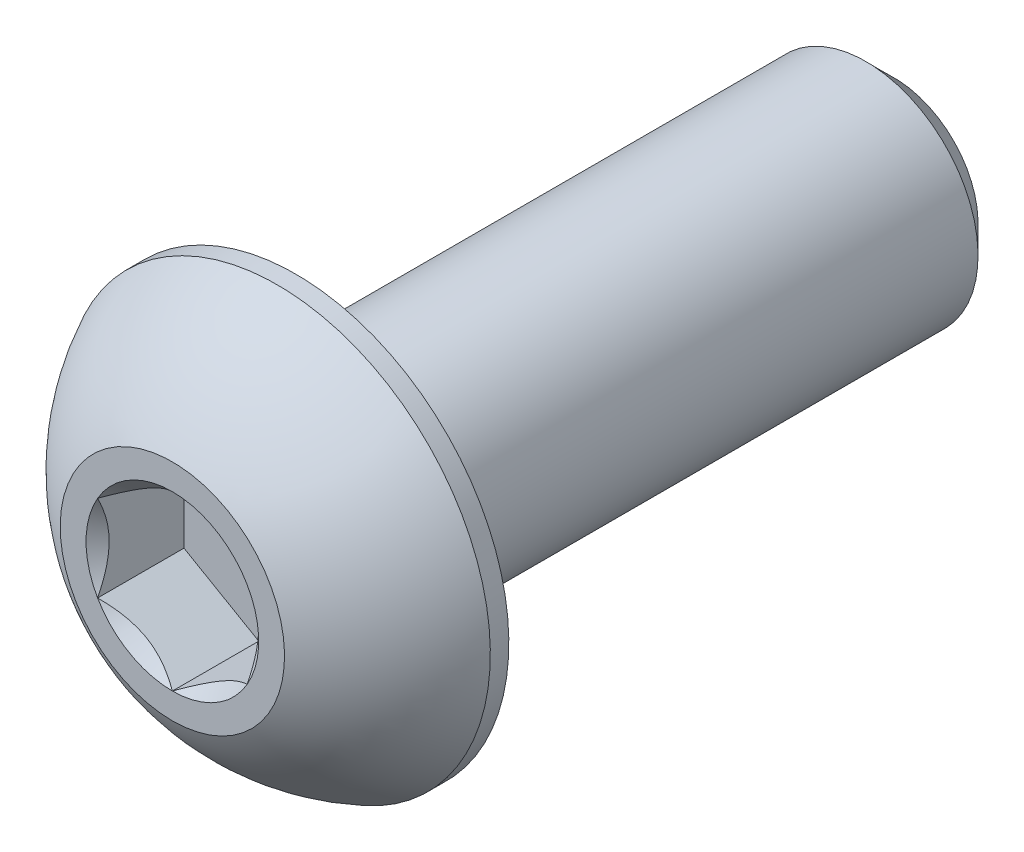
ISO-10303-21;
HEADER;
FILE_DESCRIPTION(('STEP AP214'),'2;1');
FILE_NAME('part.step','',(''),(''),'','','');
FILE_SCHEMA(('AUTOMOTIVE_DESIGN { 1 0 10303 214 1 1 1 1 }'));
ENDSEC;
DATA;
#1=APPLICATION_CONTEXT('core data for automotive mechanical design processes');
#2=APPLICATION_PROTOCOL_DEFINITION('international standard','automotive_design',2000,#1);
#3=PRODUCT_CONTEXT('',#1,'mechanical');
#4=PRODUCT('Part','Part','',(#3));
#5=PRODUCT_RELATED_PRODUCT_CATEGORY('part','',(#4));
#6=PRODUCT_DEFINITION_FORMATION('','',#4);
#7=PRODUCT_DEFINITION_CONTEXT('part definition',#1,'design');
#8=PRODUCT_DEFINITION('design','',#6,#7);
#9=PRODUCT_DEFINITION_SHAPE('','',#8);
#10=(LENGTH_UNIT() NAMED_UNIT(*) SI_UNIT(.MILLI.,.METRE.));
#11=(NAMED_UNIT(*) PLANE_ANGLE_UNIT() SI_UNIT($,.RADIAN.));
#12=(NAMED_UNIT(*) SI_UNIT($,.STERADIAN.) SOLID_ANGLE_UNIT());
#13=UNCERTAINTY_MEASURE_WITH_UNIT(LENGTH_MEASURE(1.E-05),#10,'distance_accuracy_value','');
#14=(GEOMETRIC_REPRESENTATION_CONTEXT(3) GLOBAL_UNCERTAINTY_ASSIGNED_CONTEXT((#13)) GLOBAL_UNIT_ASSIGNED_CONTEXT((#10,
#11,#12)) REPRESENTATION_CONTEXT('',''));
#15=CARTESIAN_POINT('',(0.,0.,0.));
#16=DIRECTION('',(0.,0.,1.));
#17=DIRECTION('',(1.,0.,0.));
#18=AXIS2_PLACEMENT_3D('',#15,#16,#17);
#19=CARTESIAN_POINT('',(0.,0.,-4.));
#20=DIRECTION('',(0.,0.,1.));
#21=DIRECTION('',(0.,-1.,0.));
#22=AXIS2_PLACEMENT_3D('',#19,#20,#21);
#23=PLANE('',#22);
#24=CARTESIAN_POINT('',(0.,0.,-4.));
#25=DIRECTION('',(0.,0.,1.));
#26=DIRECTION('',(0.,-1.,0.));
#27=AXIS2_PLACEMENT_3D('',#24,#25,#26);
#28=CIRCLE('',#27,1.125);
#29=CARTESIAN_POINT('',(0.,-1.125,-4.));
#30=VERTEX_POINT('',#29);
#31=EDGE_CURVE('E55',#30,#30,#28,.T.);
#32=ORIENTED_EDGE('',*,*,#31,.F.);
#33=EDGE_LOOP('',(#32));
#34=FACE_BOUND('',#33,.T.);
#35=ADVANCED_FACE('F41',(#34),#23,.F.);
#36=CARTESIAN_POINT('',(0.,0.,-4.));
#37=DIRECTION('',(0.,0.,1.));
#38=DIRECTION('',(0.,-1.,0.));
#39=AXIS2_PLACEMENT_3D('',#36,#37,#38);
#40=CONICAL_SURFACE('',#39,1.125,0.785398163397446);
#41=CARTESIAN_POINT('',(0.,0.,-3.625));
#42=DIRECTION('',(0.,0.,1.));
#43=DIRECTION('',(0.,-1.,0.));
#44=AXIS2_PLACEMENT_3D('',#41,#42,#43);
#45=CIRCLE('',#44,1.5);
#46=CARTESIAN_POINT('',(0.,-1.5,-3.625));
#47=VERTEX_POINT('',#46);
#48=EDGE_CURVE('E205',#47,#47,#45,.T.);
#49=ORIENTED_EDGE('',*,*,#48,.F.);
#50=EDGE_LOOP('',(#49));
#51=FACE_BOUND('',#50,.T.);
#52=ORIENTED_EDGE('',*,*,#31,.T.);
#53=EDGE_LOOP('',(#52));
#54=FACE_BOUND('',#53,.T.);
#55=ADVANCED_FACE('F212',(#51,#54),#40,.T.);
#56=CARTESIAN_POINT('',(0.,0.,5.65));
#57=DIRECTION('',(0.,0.,1.));
#58=DIRECTION('',(0.,-1.,0.));
#59=AXIS2_PLACEMENT_3D('',#56,#57,#58);
#60=CYLINDRICAL_SURFACE('',#59,1.5);
#61=CARTESIAN_POINT('',(0.,0.,4.));
#62=DIRECTION('',(0.,0.,1.));
#63=DIRECTION('',(0.,-1.,0.));
#64=AXIS2_PLACEMENT_3D('',#61,#62,#63);
#65=CIRCLE('',#64,1.5);
#66=CARTESIAN_POINT('',(0.,-1.5,4.));
#67=VERTEX_POINT('',#66);
#68=EDGE_CURVE('E201',#67,#67,#65,.T.);
#69=ORIENTED_EDGE('',*,*,#68,.F.);
#70=EDGE_LOOP('',(#69));
#71=FACE_BOUND('',#70,.T.);
#72=ORIENTED_EDGE('',*,*,#48,.T.);
#73=EDGE_LOOP('',(#72));
#74=FACE_BOUND('',#73,.T.);
#75=ADVANCED_FACE('F218',(#71,#74),#60,.T.);
#76=CARTESIAN_POINT('',(0.,-2.85,4.));
#77=DIRECTION('',(0.,0.,1.));
#78=DIRECTION('',(0.,-1.,0.));
#79=AXIS2_PLACEMENT_3D('',#76,#77,#78);
#80=PLANE('',#79);
#81=CARTESIAN_POINT('',(0.,0.,4.));
#82=DIRECTION('',(0.,0.,1.));
#83=DIRECTION('',(0.,-1.,0.));
#84=AXIS2_PLACEMENT_3D('',#81,#82,#83);
#85=CIRCLE('',#84,2.85);
#86=CARTESIAN_POINT('',(0.,-2.85,4.));
#87=VERTEX_POINT('',#86);
#88=EDGE_CURVE('E193',#87,#87,#85,.T.);
#89=ORIENTED_EDGE('',*,*,#88,.F.);
#90=EDGE_LOOP('',(#89));
#91=FACE_BOUND('',#90,.T.);
#92=ORIENTED_EDGE('',*,*,#68,.T.);
#93=EDGE_LOOP('',(#92));
#94=FACE_BOUND('',#93,.T.);
#95=ADVANCED_FACE('F223',(#91,#94),#80,.F.);
#96=CARTESIAN_POINT('',(0.,0.,2.85516711229947));
#97=DIRECTION('',(0.,0.,1.));
#98=DIRECTION('',(0.,-1.,0.));
#99=AXIS2_PLACEMENT_3D('',#96,#97,#98);
#100=SPHERICAL_SURFACE('',#99,3.17192226735973);
#101=CARTESIAN_POINT('',(0.,0.,5.65));
#102=DIRECTION('',(0.,0.,1.));
#103=DIRECTION('',(0.,-1.,0.));
#104=AXIS2_PLACEMENT_3D('',#101,#102,#103);
#105=CIRCLE('',#104,1.5);
#106=CARTESIAN_POINT('',(0.,-1.5,5.65));
#107=VERTEX_POINT('',#106);
#108=EDGE_CURVE('E197',#107,#107,#105,.T.);
#109=CARTESIAN_POINT('',(0.,0.,4.2475));
#110=DIRECTION('',(0.,0.,1.));
#111=DIRECTION('',(0.,-1.,0.));
#112=AXIS2_PLACEMENT_3D('',#109,#110,#111);
#113=CIRCLE('',#112,2.85);
#114=CARTESIAN_POINT('',(0.,-2.85,4.2475));
#115=VERTEX_POINT('',#114);
#116=EDGE_CURVE('E189',#115,#115,#113,.T.);
#117=CARTESIAN_POINT('',(0.,-1.5,5.65));
#118=CARTESIAN_POINT('',(0.,-1.5181600798921,5.64025343052664));
#119=CARTESIAN_POINT('',(0.,-1.53622513742981,5.63032981527615));
#120=CARTESIAN_POINT('',(0.,-1.57215840256594,5.61013236887069));
#121=CARTESIAN_POINT('',(0.,-1.59002661016438,5.59985853771571));
#122=CARTESIAN_POINT('',(0.,-1.6255593701915,5.57896453515098));
#123=CARTESIAN_POINT('',(0.,-1.64322392262019,5.56834436374123));
#124=CARTESIAN_POINT('',(0.,-1.67834266450262,5.54676172357303));
#125=CARTESIAN_POINT('',(0.,-1.69579685395635,5.53579925481458));
#126=CARTESIAN_POINT('',(0.,-1.73048823664554,5.51353618336439));
#127=CARTESIAN_POINT('',(0.,-1.74772542988098,5.50223558067265));
#128=CARTESIAN_POINT('',(0.,-1.78197627078176,5.47930053581285));
#129=CARTESIAN_POINT('',(0.,-1.79898991844709,5.46766609364478));
#130=CARTESIAN_POINT('',(0.,-1.83278720341135,5.44406779045309));
#131=CARTESIAN_POINT('',(0.,-1.84957084071028,5.43210392942946));
#132=CARTESIAN_POINT('',(0.,-1.88290172764636,5.40785133450125));
#133=CARTESIAN_POINT('',(0.,-1.8994489772835,5.39556260059666));
#134=CARTESIAN_POINT('',(0.,-1.93230080139369,5.37066492927458));
#135=CARTESIAN_POINT('',(0.,-1.94860537586673,5.35805599185708));
#136=CARTESIAN_POINT('',(0.,-1.98096565436365,5.33252270455889));
#137=CARTESIAN_POINT('',(0.,-1.99702135838753,5.31959835467819));
#138=CARTESIAN_POINT('',(0.,-2.02887779526296,5.29343915334777));
#139=CARTESIAN_POINT('',(0.,-2.04467852811452,5.28020430189805));
#140=CARTESIAN_POINT('',(0.,-2.07601901880464,5.25342912630669));
#141=CARTESIAN_POINT('',(0.,-2.09155877664321,5.23988880216506));
#142=CARTESIAN_POINT('',(0.,-2.12237141262985,5.21250782613789));
#143=CARTESIAN_POINT('',(0.,-2.13764429077792,5.19866717425237));
#144=CARTESIAN_POINT('',(0.,-2.16791736411296,5.17069080180173));
#145=CARTESIAN_POINT('',(0.,-2.18291755929993,5.15655508123663));
#146=CARTESIAN_POINT('',(0.,-2.21263956705414,5.12799394260905));
#147=CARTESIAN_POINT('',(0.,-2.22736137962139,5.11356852454658));
#148=CARTESIAN_POINT('',(0.,-2.2565210282552,5.08443347218353));
#149=CARTESIAN_POINT('',(0.,-2.27095886432177,5.06972383788295));
#150=CARTESIAN_POINT('',(0.,-2.2995450739765,5.04002594229721));
#151=CARTESIAN_POINT('',(0.,-2.31369344756465,5.02503768101205));
#152=CARTESIAN_POINT('',(0.,-2.34169535627252,4.99478822658124));
#153=CARTESIAN_POINT('',(0.,-2.35554889139223,4.97952703343559));
#154=CARTESIAN_POINT('',(0.,-2.38295585920366,4.94873751411442));
#155=CARTESIAN_POINT('',(0.,-2.39650929189537,4.9332091879389));
#156=CARTESIAN_POINT('',(0.,-2.42331090492182,4.90189130289176));
#157=CARTESIAN_POINT('',(0.,-2.43655908525656,4.88610174402014));
#158=CARTESIAN_POINT('',(0.,-2.46274515962755,4.85426739317577));
#159=CARTESIAN_POINT('',(0.,-2.47568305366379,4.83822260120302));
#160=CARTESIAN_POINT('',(0.,-2.5012436393965,4.80588388073287));
#161=CARTESIAN_POINT('',(0.,-2.51386633109298,4.78958995223548));
#162=CARTESIAN_POINT('',(0.,-2.53879171587278,4.7567591499574));
#163=CARTESIAN_POINT('',(0.,-2.55109440895612,4.74022227617671));
#164=CARTESIAN_POINT('',(0.,-2.57537512182785,4.70691186688636));
#165=CARTESIAN_POINT('',(0.,-2.58735314161625,4.6901383313767));
#166=CARTESIAN_POINT('',(0.,-2.61097995657956,4.65636097210575));
#167=CARTESIAN_POINT('',(0.,-2.62262875175448,4.63935714834448));
#168=CARTESIAN_POINT('',(0.,-2.64559269128198,4.60512567355775));
#169=CARTESIAN_POINT('',(0.,-2.65690783563457,4.58789802253229));
#170=CARTESIAN_POINT('',(0.,-2.67920017403639,4.55322543922701));
#171=CARTESIAN_POINT('',(0.,-2.69017736808561,4.53578050694718));
#172=CARTESIAN_POINT('',(0.,-2.71178963499899,4.50067998980005));
#173=CARTESIAN_POINT('',(0.,-2.72242470786316,4.48302440493275));
#174=CARTESIAN_POINT('',(0.,-2.74334869082117,4.44750929096057));
#175=CARTESIAN_POINT('',(0.,-2.75363760091502,4.42964976185571));
#176=CARTESIAN_POINT('',(0.,-2.77386535089241,4.39373354659176));
#177=CARTESIAN_POINT('',(0.,-2.78380419077596,4.37567686043267));
#178=CARTESIAN_POINT('',(0.,-2.80332801615778,4.33937318815589));
#179=CARTESIAN_POINT('',(0.,-2.81291300165605,4.32112620203818));
#180=CARTESIAN_POINT('',(0.,-2.83172550494215,4.2844488779161));
#181=CARTESIAN_POINT('',(0.,-2.84095302272998,4.26601853991173));
#182=CARTESIAN_POINT('',(0.,-2.85,4.2475));
#183=B_SPLINE_CURVE_WITH_KNOTS('',3,(#117,#118,#119,#120,#121,#122,#123,#124,#125,#126,#127,
#128,#129,#130,#131,#132,#133,#134,#135,#136,#137,#138,#139,#140,#141,#142,#143,#144,#145,#146,
#147,#148,#149,#150,#151,#152,#153,#154,#155,#156,#157,#158,#159,#160,#161,#162,#163,#164,#165,
#166,#167,#168,#169,#170,#171,#172,#173,#174,#175,#176,#177,#178,#179,#180,#181,#182),
.UNSPECIFIED.,.F.,.F.,(4,2,2,2,2,2,2,2,2,2,2,2,2,2,2,2,2,2,2,2,2,2,2,2,2,2,2,2,2,2,2,2,4),(0.,
0.0618298941826982,0.123659788365396,0.185489682548094,0.247319576730793,0.309149470913491,
0.370979365096189,0.432809259278888,0.494639153461586,0.556469047644284,0.618298941826983,
0.68012883600968,0.741958730192379,0.803788624375077,0.865618518557775,0.927448412740473,
0.989278306923172,1.05110820110587,1.11293809528857,1.17476798947127,1.23659788365397,
1.29842777783666,1.36025767201936,1.42208756620206,1.48391746038476,1.54574735456746,
1.60757724875015,1.66940714293285,1.73123703711555,1.79306693129825,1.85489682548095,
1.91672671966365,1.97855661384634),.UNSPECIFIED.);
#184=EDGE_CURVE('BSEAM228',#107,#115,#183,.T.);
#185=ORIENTED_EDGE('',*,*,#108,.F.);
#186=ORIENTED_EDGE('',*,*,#116,.T.);
#187=ORIENTED_EDGE('',*,*,#184,.T.);
#188=ORIENTED_EDGE('',*,*,#184,.F.);
#189=EDGE_LOOP('',(#185,#187,#186,#188));
#190=FACE_BOUND('',#189,.T.);
#191=ADVANCED_FACE('F228',(#190),#100,.T.);
#192=CARTESIAN_POINT('',(0.,-1.5,5.65));
#193=DIRECTION('',(0.,0.,-1.));
#194=DIRECTION('',(0.,1.,0.));
#195=AXIS2_PLACEMENT_3D('',#192,#193,#194);
#196=PLANE('',#195);
#197=CARTESIAN_POINT('',(0.,0.,5.65));
#198=DIRECTION('',(0.,0.,1.));
#199=DIRECTION('',(1.,0.,0.));
#200=AXIS2_PLACEMENT_3D('',#197,#198,#199);
#201=CIRCLE('',#200,1.15470053837925);
#202=CARTESIAN_POINT('',(0.,1.15470053837925,5.65));
#203=VERTEX_POINT('',#202);
#204=CARTESIAN_POINT('',(-1.,0.577350269189623,5.65));
#205=VERTEX_POINT('',#204);
#206=EDGE_CURVE('E146',#203,#205,#201,.T.);
#207=ORIENTED_EDGE('',*,*,#206,.F.);
#208=CARTESIAN_POINT('',(1.,0.577350269189625,5.65));
#209=VERTEX_POINT('',#208);
#210=EDGE_CURVE('E141',#209,#203,#201,.T.);
#211=ORIENTED_EDGE('',*,*,#210,.F.);
#212=CARTESIAN_POINT('',(1.,-0.577350269189626,5.65));
#213=VERTEX_POINT('',#212);
#214=EDGE_CURVE('E109',#213,#209,#201,.T.);
#215=ORIENTED_EDGE('',*,*,#214,.F.);
#216=CARTESIAN_POINT('',(0.,-1.15470053837925,5.65));
#217=VERTEX_POINT('',#216);
#218=EDGE_CURVE('E100',#217,#213,#201,.T.);
#219=ORIENTED_EDGE('',*,*,#218,.F.);
#220=CARTESIAN_POINT('',(-1.,-0.577350269189627,5.65));
#221=VERTEX_POINT('',#220);
#222=EDGE_CURVE('E61',#221,#217,#201,.T.);
#223=ORIENTED_EDGE('',*,*,#222,.F.);
#224=EDGE_CURVE('E68',#205,#221,#201,.T.);
#225=ORIENTED_EDGE('',*,*,#224,.F.);
#226=EDGE_LOOP('',(#207,#211,#215,#219,#223,#225));
#227=FACE_BOUND('',#226,.T.);
#228=ORIENTED_EDGE('',*,*,#108,.T.);
#229=EDGE_LOOP('',(#228));
#230=FACE_BOUND('',#229,.T.);
#231=ADVANCED_FACE('F138',(#227,#230),#196,.F.);
#232=CARTESIAN_POINT('',(0.,0.,5.65));
#233=DIRECTION('',(0.,0.,1.));
#234=DIRECTION('',(0.,-1.,0.));
#235=AXIS2_PLACEMENT_3D('',#232,#233,#234);
#236=CYLINDRICAL_SURFACE('',#235,2.85);
#237=ORIENTED_EDGE('',*,*,#116,.F.);
#238=EDGE_LOOP('',(#237));
#239=FACE_BOUND('',#238,.T.);
#240=ORIENTED_EDGE('',*,*,#88,.T.);
#241=EDGE_LOOP('',(#240));
#242=FACE_BOUND('',#241,.T.);
#243=ADVANCED_FACE('F234',(#239,#242),#236,.T.);
#244=CARTESIAN_POINT('',(0.,0.,5.65));
#245=DIRECTION('',(0.,0.,1.));
#246=DIRECTION('',(1.,0.,0.));
#247=AXIS2_PLACEMENT_3D('',#244,#245,#246);
#248=CONICAL_SURFACE('',#247,1.15470053837925,0.78539816339745);
#249=ORIENTED_EDGE('',*,*,#214,.T.);
#250=CARTESIAN_POINT('',(1.,-1.15147208646462,6.02038567751386));
#251=CARTESIAN_POINT('',(1.,-1.12343447988552,5.99921991987371));
#252=CARTESIAN_POINT('',(1.,-1.09524064850697,5.97826169217591));
#253=CARTESIAN_POINT('',(1.,-1.03847715644376,5.93684602223562));
#254=CARTESIAN_POINT('',(1.,-1.00990740382975,5.91638870612366));
#255=CARTESIAN_POINT('',(1.,-0.923120894333478,5.85560479495451));
#256=CARTESIAN_POINT('',(1.,-0.864253173759061,5.8161922289614));
#257=CARTESIAN_POINT('',(1.,-0.740809858258047,5.73882066420021));
#258=CARTESIAN_POINT('',(1.,-0.676100255137808,5.70107303911434));
#259=CARTESIAN_POINT('',(1.,-0.543448939049125,5.63202458755129));
#260=CARTESIAN_POINT('',(1.,-0.47551911202778,5.60070202784687));
#261=CARTESIAN_POINT('',(1.,-0.37355585033353,5.5623817788838));
#262=CARTESIAN_POINT('',(1.,-0.341031989670909,5.55138359164216));
#263=CARTESIAN_POINT('',(1.,-0.275199079052294,5.53199834214736));
#264=CARTESIAN_POINT('',(1.,-0.241889975173934,5.5236114597767));
#265=CARTESIAN_POINT('',(1.,-0.175247517042993,5.51002522071902));
#266=CARTESIAN_POINT('',(1.,-0.141925568218176,5.50477079076797));
#267=CARTESIAN_POINT('',(1.,-0.0749144362322799,5.49754868657089));
#268=CARTESIAN_POINT('',(1.,-0.0412251978501627,5.49558151361051));
#269=CARTESIAN_POINT('',(1.,0.0249580992634199,5.49508319839316));
#270=CARTESIAN_POINT('',(1.,0.0574512826460382,5.49643026788863));
#271=CARTESIAN_POINT('',(1.,0.122148505701866,5.50221648449898));
#272=CARTESIAN_POINT('',(1.,0.154352610132925,5.50665492066154));
#273=CARTESIAN_POINT('',(1.,0.218799898867639,5.5184568301452));
#274=CARTESIAN_POINT('',(1.,0.251033743268952,5.52587054103851));
#275=CARTESIAN_POINT('',(1.,0.314797132354918,5.54322894249868));
#276=CARTESIAN_POINT('',(1.,0.346326735731004,5.55317342128883));
#277=CARTESIAN_POINT('',(1.,0.445594187730204,5.58822348255434));
#278=CARTESIAN_POINT('',(1.,0.511919139476035,5.61732085835672));
#279=CARTESIAN_POINT('',(1.,0.641453244657531,5.6820153296865));
#280=CARTESIAN_POINT('',(1.,0.704650133126343,5.71763577671524));
#281=CARTESIAN_POINT('',(1.,0.825428490174985,5.79112390134693));
#282=CARTESIAN_POINT('',(1.,0.883132947867683,5.82879194713546));
#283=CARTESIAN_POINT('',(1.,0.968148853704563,5.88702285294316));
#284=CARTESIAN_POINT('',(1.,0.996120570380283,5.90663847576286));
#285=CARTESIAN_POINT('',(1.,1.05168177729901,5.94638851706127));
#286=CARTESIAN_POINT('',(1.,1.079271369977,5.96652279219883));
#287=CARTESIAN_POINT('',(1.,1.10670185346329,5.98687211907297));
#288=B_SPLINE_CURVE_WITH_KNOTS('',3,(#250,#251,#252,#253,#254,#255,#256,#257,#258,#259,#260,
#261,#262,#263,#264,#265,#266,#267,#268,#269,#270,#271,#272,#273,#274,#275,#276,#277,#278,#279,
#280,#281,#282,#283,#284,#285,#286,#287),.UNSPECIFIED.,.F.,.F.,(4,2,2,2,2,2,2,2,2,2,2,2,2,2,2,2,
2,2,4),(0.,0.105386459083291,0.210799187330125,0.423233611565469,0.647793540908504,
0.87158087773861,0.974493074181421,1.07741235827201,1.17846428203205,1.27953161415762,
1.3769408673961,1.47432772585408,1.57343322804293,1.67253043972851,1.88917353996827,
2.10660791038813,2.31323734249843,2.41572589232044,2.51818641476503),.UNSPECIFIED.);
#289=EDGE_CURVE('E11',#213,#209,#288,.T.);
#290=ORIENTED_EDGE('',*,*,#289,.F.);
#291=EDGE_LOOP('',(#249,#290));
#292=FACE_BOUND('',#291,.T.);
#293=ADVANCED_FACE('F113',(#292),#248,.F.);
#294=ORIENTED_EDGE('',*,*,#210,.T.);
#295=CARTESIAN_POINT('',(1.0002,0.577234799135786,5.65011548737261));
#296=CARTESIAN_POINT('',(0.965817404992819,0.59708559961862,5.63027793082573));
#297=CARTESIAN_POINT('',(0.930859881860175,0.617268335009454,5.61160502063889));
#298=CARTESIAN_POINT('',(0.85957719704391,0.658423412276684,5.57741474272316));
#299=CARTESIAN_POINT('',(0.823245249471015,0.679399671988078,5.56191640902346));
#300=CARTESIAN_POINT('',(0.749983386196688,0.721697428470845,5.53536730714227));
#301=CARTESIAN_POINT('',(0.713072148554585,0.743008141459635,5.52424977399693));
#302=CARTESIAN_POINT('',(0.63843727068914,0.786098608286185,5.50711986577618));
#303=CARTESIAN_POINT('',(0.600715911891363,0.807877044942279,5.50109469746667));
#304=CARTESIAN_POINT('',(0.535707801582065,0.845409494928861,5.49566055496749));
#305=CARTESIAN_POINT('',(0.508505628471827,0.8611146768966,5.49485693831673));
#306=CARTESIAN_POINT('',(0.454153959330887,0.892494627706028,5.49620669941689));
#307=CARTESIAN_POINT('',(0.427004476245123,0.908169389073952,5.4983607295472));
#308=CARTESIAN_POINT('',(0.345943722673039,0.954969836969509,5.50911697212847));
#309=CARTESIAN_POINT('',(0.292435859021571,0.985862616452446,5.52201455641536));
#310=CARTESIAN_POINT('',(0.198523934856567,1.04008269114923,5.55314073060218));
#311=CARTESIAN_POINT('',(0.157679476328165,1.0636642502755,5.56973779770184));
#312=CARTESIAN_POINT('',(0.0775903626180559,1.10990372163519,5.60712492468529));
#313=CARTESIAN_POINT('',(0.038340989129562,1.1325643579843,5.6279013418174));
#314=CARTESIAN_POINT('',(-0.000200000000000032,1.15481600843309,5.65011548737261));
#315=B_SPLINE_CURVE_WITH_KNOTS('',3,(#295,#296,#297,#298,#299,#300,#301,#302,#303,#304,#305,
#306,#307,#308,#309,#310,#311,#312,#313,#314),.UNSPECIFIED.,.F.,.F.,(4,2,2,2,2,2,2,2,2,4),(0.,
0.13323767682856,0.267252229834491,0.399137076269301,0.53068960328077,0.624814864263848,
0.718960890149134,0.907306626112099,1.05710100361789,1.20641411519286),.UNSPECIFIED.);
#316=EDGE_CURVE('E145',#209,#203,#315,.T.);
#317=ORIENTED_EDGE('',*,*,#316,.F.);
#318=EDGE_LOOP('',(#294,#317));
#319=FACE_BOUND('',#318,.T.);
#320=ADVANCED_FACE('F321',(#319),#248,.F.);
#321=ORIENTED_EDGE('',*,*,#206,.T.);
#322=CARTESIAN_POINT('',(0.000199999999999735,1.15481600843309,5.65011548737261));
#323=CARTESIAN_POINT('',(-0.0341825950071808,1.13496520795025,5.63027793082573));
#324=CARTESIAN_POINT('',(-0.069140118139825,1.11478247255942,5.61160502063889));
#325=CARTESIAN_POINT('',(-0.14042280295609,1.07362739529219,5.57741474272316));
#326=CARTESIAN_POINT('',(-0.176754750528984,1.0526511355808,5.56191640902346));
#327=CARTESIAN_POINT('',(-0.250016613803311,1.01035337909803,5.53536730714227));
#328=CARTESIAN_POINT('',(-0.286927851445415,0.989042666109238,5.52424977399693));
#329=CARTESIAN_POINT('',(-0.361562729310859,0.945952199282689,5.50711986577618));
#330=CARTESIAN_POINT('',(-0.399284088108636,0.924173762626594,5.50109469746667));
#331=CARTESIAN_POINT('',(-0.464292198417934,0.886641312640012,5.49566055496749));
#332=CARTESIAN_POINT('',(-0.491494371528172,0.870936130672273,5.49485693831673));
#333=CARTESIAN_POINT('',(-0.545846040669112,0.839556179862846,5.49620669941689));
#334=CARTESIAN_POINT('',(-0.572995523754876,0.823881418494921,5.4983607295472));
#335=CARTESIAN_POINT('',(-0.65405627732696,0.777080970599364,5.50911697212847));
#336=CARTESIAN_POINT('',(-0.707564140978427,0.746188191116428,5.52201455641536));
#337=CARTESIAN_POINT('',(-0.801476065143431,0.691968116419647,5.55314073060218));
#338=CARTESIAN_POINT('',(-0.842320523671834,0.668386557293369,5.56973779770184));
#339=CARTESIAN_POINT('',(-0.922409637381943,0.622147085933679,5.60712492468529));
#340=CARTESIAN_POINT('',(-0.961659010870437,0.599486449584573,5.6279013418174));
#341=CARTESIAN_POINT('',(-1.0002,0.577234799135786,5.65011548737261));
#342=B_SPLINE_CURVE_WITH_KNOTS('',3,(#322,#323,#324,#325,#326,#327,#328,#329,#330,#331,#332,
#333,#334,#335,#336,#337,#338,#339,#340,#341),.UNSPECIFIED.,.F.,.F.,(4,2,2,2,2,2,2,2,2,4),(0.,
0.133237676828559,0.26725222983449,0.3991370762693,0.530689603280768,0.624814864263846,
0.718960890149133,0.907306626112097,1.05710100361789,1.20641411519286),.UNSPECIFIED.);
#343=EDGE_CURVE('E151',#203,#205,#342,.T.);
#344=ORIENTED_EDGE('',*,*,#343,.F.);
#345=EDGE_LOOP('',(#321,#344));
#346=FACE_BOUND('',#345,.T.);
#347=ADVANCED_FACE('F156',(#346),#248,.F.);
#348=ORIENTED_EDGE('',*,*,#224,.T.);
#349=CARTESIAN_POINT('',(-1.,-1.15147208646462,6.02038567751386));
#350=CARTESIAN_POINT('',(-1.,-1.12343447988552,5.99921991987371));
#351=CARTESIAN_POINT('',(-1.,-1.09524064850697,5.97826169217591));
#352=CARTESIAN_POINT('',(-1.,-1.03847715644376,5.93684602223562));
#353=CARTESIAN_POINT('',(-1.,-1.00990740382975,5.91638870612366));
#354=CARTESIAN_POINT('',(-1.,-0.923120894333479,5.85560479495451));
#355=CARTESIAN_POINT('',(-1.,-0.864253173759061,5.8161922289614));
#356=CARTESIAN_POINT('',(-1.,-0.740809858258047,5.73882066420021));
#357=CARTESIAN_POINT('',(-1.,-0.676100255137809,5.70107303911434));
#358=CARTESIAN_POINT('',(-1.,-0.543448939049126,5.63202458755129));
#359=CARTESIAN_POINT('',(-1.,-0.47551911202778,5.60070202784687));
#360=CARTESIAN_POINT('',(-1.,-0.37355585033353,5.5623817788838));
#361=CARTESIAN_POINT('',(-1.,-0.341031989670909,5.55138359164216));
#362=CARTESIAN_POINT('',(-1.,-0.275199079052295,5.53199834214736));
#363=CARTESIAN_POINT('',(-1.,-0.241889975173934,5.5236114597767));
#364=CARTESIAN_POINT('',(-1.,-0.175247517042994,5.51002522071902));
#365=CARTESIAN_POINT('',(-1.,-0.141925568218176,5.50477079076797));
#366=CARTESIAN_POINT('',(-1.,-0.0749144362322801,5.49754868657089));
#367=CARTESIAN_POINT('',(-1.,-0.0412251978501628,5.49558151361051));
#368=CARTESIAN_POINT('',(-1.,0.02495809926342,5.49508319839316));
#369=CARTESIAN_POINT('',(-1.,0.0574512826460383,5.49643026788863));
#370=CARTESIAN_POINT('',(-1.,0.122148505701866,5.50221648449898));
#371=CARTESIAN_POINT('',(-1.,0.154352610132925,5.50665492066154));
#372=CARTESIAN_POINT('',(-1.,0.218799898867639,5.5184568301452));
#373=CARTESIAN_POINT('',(-1.,0.251033743268953,5.52587054103851));
#374=CARTESIAN_POINT('',(-1.,0.314797132354918,5.54322894249868));
#375=CARTESIAN_POINT('',(-1.,0.346326735731003,5.55317342128883));
#376=CARTESIAN_POINT('',(-1.,0.445594187730203,5.58822348255434));
#377=CARTESIAN_POINT('',(-1.,0.511919139476035,5.61732085835672));
#378=CARTESIAN_POINT('',(-1.,0.64145324465753,5.6820153296865));
#379=CARTESIAN_POINT('',(-1.,0.704650133126342,5.71763577671524));
#380=CARTESIAN_POINT('',(-1.,0.825428490174984,5.79112390134693));
#381=CARTESIAN_POINT('',(-1.,0.883132947867681,5.82879194713546));
#382=CARTESIAN_POINT('',(-1.,0.968148853704562,5.88702285294316));
#383=CARTESIAN_POINT('',(-1.,0.996120570380282,5.90663847576285));
#384=CARTESIAN_POINT('',(-1.,1.05168177729901,5.94638851706127));
#385=CARTESIAN_POINT('',(-1.,1.079271369977,5.96652279219883));
#386=CARTESIAN_POINT('',(-1.,1.10670185346329,5.98687211907297));
#387=B_SPLINE_CURVE_WITH_KNOTS('',3,(#349,#350,#351,#352,#353,#354,#355,#356,#357,#358,#359,
#360,#361,#362,#363,#364,#365,#366,#367,#368,#369,#370,#371,#372,#373,#374,#375,#376,#377,#378,
#379,#380,#381,#382,#383,#384,#385,#386),.UNSPECIFIED.,.F.,.F.,(4,2,2,2,2,2,2,2,2,2,2,2,2,2,2,2,
2,2,4),(0.,0.105386459083291,0.210799187330125,0.42323361156547,0.647793540908505,
0.871580877738611,0.974493074181422,1.07741235827201,1.17846428203205,1.27953161415762,
1.37694086739611,1.47432772585408,1.57343322804293,1.67253043972852,1.88917353996827,
2.10660791038813,2.31323734249843,2.41572589232044,2.51818641476503),.UNSPECIFIED.);
#388=EDGE_CURVE('E159',#205,#221,#387,.F.);
#389=ORIENTED_EDGE('',*,*,#388,.F.);
#390=EDGE_LOOP('',(#348,#389));
#391=FACE_BOUND('',#390,.T.);
#392=ADVANCED_FACE('F160',(#391),#248,.F.);
#393=ORIENTED_EDGE('',*,*,#222,.T.);
#394=CARTESIAN_POINT('',(-1.0002,-0.57723479913579,5.65011548737261));
#395=CARTESIAN_POINT('',(-0.965817404992818,-0.597085599618623,5.63027793082573));
#396=CARTESIAN_POINT('',(-0.930859881860174,-0.617268335009458,5.61160502063889));
#397=CARTESIAN_POINT('',(-0.85957719704391,-0.658423412276688,5.57741474272316));
#398=CARTESIAN_POINT('',(-0.823245249471016,-0.679399671988081,5.56191640902346));
#399=CARTESIAN_POINT('',(-0.749983386196689,-0.721697428470848,5.53536730714227));
#400=CARTESIAN_POINT('',(-0.713072148554585,-0.743008141459638,5.52424977399693));
#401=CARTESIAN_POINT('',(-0.638437270689141,-0.786098608286187,5.50711986577618));
#402=CARTESIAN_POINT('',(-0.600715911891364,-0.807877044942282,5.50109469746667));
#403=CARTESIAN_POINT('',(-0.535707801582067,-0.845409494928864,5.49566055496749));
#404=CARTESIAN_POINT('',(-0.508505628471828,-0.861114676896603,5.49485693831673));
#405=CARTESIAN_POINT('',(-0.454153959330888,-0.89249462770603,5.49620669941689));
#406=CARTESIAN_POINT('',(-0.427004476245124,-0.908169389073955,5.4983607295472));
#407=CARTESIAN_POINT('',(-0.34594372267304,-0.954969836969512,5.50911697212847));
#408=CARTESIAN_POINT('',(-0.292435859021573,-0.985862616452448,5.52201455641536));
#409=CARTESIAN_POINT('',(-0.198523934856568,-1.04008269114923,5.55314073060218));
#410=CARTESIAN_POINT('',(-0.157679476328165,-1.06366425027551,5.56973779770184));
#411=CARTESIAN_POINT('',(-0.0775903626180559,-1.1099037216352,5.60712492468529));
#412=CARTESIAN_POINT('',(-0.0383409891295619,-1.1325643579843,5.6279013418174));
#413=CARTESIAN_POINT('',(0.000200000000000337,-1.15481600843309,5.65011548737262));
#414=B_SPLINE_CURVE_WITH_KNOTS('',3,(#394,#395,#396,#397,#398,#399,#400,#401,#402,#403,#404,
#405,#406,#407,#408,#409,#410,#411,#412,#413),.UNSPECIFIED.,.F.,.F.,(4,2,2,2,2,2,2,2,2,4),(0.,
0.133237676828559,0.26725222983449,0.3991370762693,0.530689603280767,0.624814864263845,
0.718960890149132,0.907306626112096,1.05710100361789,1.20641411519286),.UNSPECIFIED.);
#415=EDGE_CURVE('E126',#221,#217,#414,.T.);
#416=ORIENTED_EDGE('',*,*,#415,.F.);
#417=EDGE_LOOP('',(#393,#416));
#418=FACE_BOUND('',#417,.T.);
#419=ADVANCED_FACE('F262',(#418),#248,.F.);
#420=ORIENTED_EDGE('',*,*,#218,.T.);
#421=CARTESIAN_POINT('',(-0.000199999999999511,-1.15481600843309,5.65011548737262));
#422=CARTESIAN_POINT('',(0.034182595007181,-1.13496520795026,5.63027793082573));
#423=CARTESIAN_POINT('',(0.0691401181398251,-1.11478247255942,5.61160502063889));
#424=CARTESIAN_POINT('',(0.14042280295609,-1.07362739529219,5.57741474272316));
#425=CARTESIAN_POINT('',(0.176754750528984,-1.0526511355808,5.56191640902346));
#426=CARTESIAN_POINT('',(0.250016613803311,-1.01035337909803,5.53536730714227));
#427=CARTESIAN_POINT('',(0.286927851445414,-0.989042666109242,5.52424977399693));
#428=CARTESIAN_POINT('',(0.361562729310859,-0.945952199282693,5.50711986577618));
#429=CARTESIAN_POINT('',(0.399284088108635,-0.924173762626598,5.50109469746667));
#430=CARTESIAN_POINT('',(0.464292198417933,-0.886641312640016,5.4956605549675));
#431=CARTESIAN_POINT('',(0.491494371528172,-0.870936130672277,5.49485693831673));
#432=CARTESIAN_POINT('',(0.545846040669111,-0.83955617986285,5.49620669941689));
#433=CARTESIAN_POINT('',(0.572995523754875,-0.823881418494925,5.4983607295472));
#434=CARTESIAN_POINT('',(0.65405627732696,-0.777080970599368,5.50911697212847));
#435=CARTESIAN_POINT('',(0.707564140978427,-0.746188191116432,5.52201455641536));
#436=CARTESIAN_POINT('',(0.801476065143431,-0.691968116419651,5.55314073060218));
#437=CARTESIAN_POINT('',(0.842320523671834,-0.668386557293373,5.56973779770184));
#438=CARTESIAN_POINT('',(0.922409637381943,-0.622147085933683,5.60712492468529));
#439=CARTESIAN_POINT('',(0.961659010870437,-0.599486449584577,5.6279013418174));
#440=CARTESIAN_POINT('',(1.0002,-0.577234799135789,5.65011548737262));
#441=B_SPLINE_CURVE_WITH_KNOTS('',3,(#421,#422,#423,#424,#425,#426,#427,#428,#429,#430,#431,
#432,#433,#434,#435,#436,#437,#438,#439,#440),.UNSPECIFIED.,.F.,.F.,(4,2,2,2,2,2,2,2,2,4),(0.,
0.133237676828559,0.26725222983449,0.399137076269299,0.530689603280767,0.624814864263845,
0.718960890149132,0.907306626112096,1.05710100361789,1.20641411519286),.UNSPECIFIED.);
#442=EDGE_CURVE('E104',#217,#213,#441,.T.);
#443=ORIENTED_EDGE('',*,*,#442,.F.);
#444=EDGE_LOOP('',(#420,#443));
#445=FACE_BOUND('',#444,.T.);
#446=ADVANCED_FACE('F102',(#445),#248,.F.);
#447=CARTESIAN_POINT('',(1.,-0.577350269189627,4.495));
#448=DIRECTION('',(0.,0.,1.));
#449=DIRECTION('',(1.,0.,0.));
#450=AXIS2_PLACEMENT_3D('',#447,#448,#449);
#451=PLANE('',#450);
#452=DIRECTION('',(0.866025403784438,0.5,0.));
#453=VECTOR('',#452,1.);
#454=CARTESIAN_POINT('',(0.,-1.15470053837925,4.495));
#455=LINE('',#454,#453);
#456=CARTESIAN_POINT('',(0.,-1.15470053837925,4.495));
#457=VERTEX_POINT('',#456);
#458=CARTESIAN_POINT('',(1.,-0.577350269189627,4.495));
#459=VERTEX_POINT('',#458);
#460=EDGE_CURVE('E125',#457,#459,#455,.T.);
#461=ORIENTED_EDGE('',*,*,#460,.T.);
#462=DIRECTION('',(0.,1.,0.));
#463=VECTOR('',#462,1.);
#464=CARTESIAN_POINT('',(1.,-0.577350269189627,4.495));
#465=LINE('',#464,#463);
#466=CARTESIAN_POINT('',(1.,0.577350269189624,4.495));
#467=VERTEX_POINT('',#466);
#468=EDGE_CURVE('E130',#459,#467,#465,.T.);
#469=ORIENTED_EDGE('',*,*,#468,.T.);
#470=DIRECTION('',(-0.866025403784439,0.5,0.));
#471=VECTOR('',#470,1.);
#472=CARTESIAN_POINT('',(1.,0.577350269189624,4.495));
#473=LINE('',#472,#471);
#474=CARTESIAN_POINT('',(0.,1.15470053837925,4.495));
#475=VERTEX_POINT('',#474);
#476=EDGE_CURVE('E296',#467,#475,#473,.T.);
#477=ORIENTED_EDGE('',*,*,#476,.T.);
#478=DIRECTION('',(-0.866025403784438,-0.5,0.));
#479=VECTOR('',#478,1.);
#480=CARTESIAN_POINT('',(0.,1.15470053837925,4.495));
#481=LINE('',#480,#479);
#482=CARTESIAN_POINT('',(-1.,0.577350269189624,4.495));
#483=VERTEX_POINT('',#482);
#484=EDGE_CURVE('E299',#475,#483,#481,.T.);
#485=ORIENTED_EDGE('',*,*,#484,.T.);
#486=DIRECTION('',(0.,-1.,0.));
#487=VECTOR('',#486,1.);
#488=CARTESIAN_POINT('',(-1.,0.577350269189624,4.495));
#489=LINE('',#488,#487);
#490=CARTESIAN_POINT('',(-1.,-0.577350269189627,4.495));
#491=VERTEX_POINT('',#490);
#492=EDGE_CURVE('E176',#483,#491,#489,.T.);
#493=ORIENTED_EDGE('',*,*,#492,.T.);
#494=DIRECTION('',(0.866025403784439,-0.5,0.));
#495=VECTOR('',#494,1.);
#496=CARTESIAN_POINT('',(-1.,-0.577350269189627,4.495));
#497=LINE('',#496,#495);
#498=EDGE_CURVE('E134',#491,#457,#497,.T.);
#499=ORIENTED_EDGE('',*,*,#498,.T.);
#500=EDGE_LOOP('',(#461,#469,#477,#485,#493,#499));
#501=FACE_BOUND('',#500,.T.);
#502=ADVANCED_FACE('F261',(#501),#451,.T.);
#503=CARTESIAN_POINT('',(1.,-0.577350269189627,4.495));
#504=DIRECTION('',(1.,0.,0.));
#505=DIRECTION('',(0.,0.,-1.));
#506=AXIS2_PLACEMENT_3D('',#503,#504,#505);
#507=PLANE('',#506);
#508=DIRECTION('',(0.,0.,1.));
#509=VECTOR('',#508,1.);
#510=CARTESIAN_POINT('',(1.,-0.577350269189627,4.495));
#511=LINE('',#510,#509);
#512=EDGE_CURVE('E121',#459,#213,#511,.T.);
#513=ORIENTED_EDGE('',*,*,#512,.T.);
#514=ORIENTED_EDGE('',*,*,#289,.T.);
#515=DIRECTION('',(0.,0.,1.));
#516=VECTOR('',#515,1.);
#517=CARTESIAN_POINT('',(1.,0.577350269189624,4.495));
#518=LINE('',#517,#516);
#519=EDGE_CURVE('E133',#467,#209,#518,.T.);
#520=ORIENTED_EDGE('',*,*,#519,.F.);
#521=ORIENTED_EDGE('',*,*,#468,.F.);
#522=EDGE_LOOP('',(#513,#514,#520,#521));
#523=FACE_BOUND('',#522,.T.);
#524=ADVANCED_FACE('F128',(#523),#507,.F.);
#525=CARTESIAN_POINT('',(1.,0.577350269189624,4.495));
#526=DIRECTION('',(0.5,0.866025403784439,0.));
#527=DIRECTION('',(-0.866025403784439,0.5,0.));
#528=AXIS2_PLACEMENT_3D('',#525,#526,#527);
#529=PLANE('',#528);
#530=ORIENTED_EDGE('',*,*,#519,.T.);
#531=ORIENTED_EDGE('',*,*,#316,.T.);
#532=DIRECTION('',(0.,0.,1.));
#533=VECTOR('',#532,1.);
#534=CARTESIAN_POINT('',(0.,1.15470053837925,4.495));
#535=LINE('',#534,#533);
#536=EDGE_CURVE('E171',#475,#203,#535,.T.);
#537=ORIENTED_EDGE('',*,*,#536,.F.);
#538=ORIENTED_EDGE('',*,*,#476,.F.);
#539=EDGE_LOOP('',(#530,#531,#537,#538));
#540=FACE_BOUND('',#539,.T.);
#541=ADVANCED_FACE('F287',(#540),#529,.F.);
#542=CARTESIAN_POINT('',(0.,1.15470053837925,4.495));
#543=DIRECTION('',(-0.5,0.866025403784439,0.));
#544=DIRECTION('',(-0.866025403784439,-0.5,0.));
#545=AXIS2_PLACEMENT_3D('',#542,#543,#544);
#546=PLANE('',#545);
#547=ORIENTED_EDGE('',*,*,#536,.T.);
#548=ORIENTED_EDGE('',*,*,#343,.T.);
#549=DIRECTION('',(0.,0.,1.));
#550=VECTOR('',#549,1.);
#551=CARTESIAN_POINT('',(-1.,0.577350269189624,4.495));
#552=LINE('',#551,#550);
#553=EDGE_CURVE('E169',#483,#205,#552,.T.);
#554=ORIENTED_EDGE('',*,*,#553,.F.);
#555=ORIENTED_EDGE('',*,*,#484,.F.);
#556=EDGE_LOOP('',(#547,#548,#554,#555));
#557=FACE_BOUND('',#556,.T.);
#558=ADVANCED_FACE('F167',(#557),#546,.F.);
#559=CARTESIAN_POINT('',(-1.,0.577350269189624,4.495));
#560=DIRECTION('',(-1.,0.,0.));
#561=DIRECTION('',(0.,0.,1.));
#562=AXIS2_PLACEMENT_3D('',#559,#560,#561);
#563=PLANE('',#562);
#564=ORIENTED_EDGE('',*,*,#553,.T.);
#565=ORIENTED_EDGE('',*,*,#388,.T.);
#566=DIRECTION('',(0.,0.,1.));
#567=VECTOR('',#566,1.);
#568=CARTESIAN_POINT('',(-1.,-0.577350269189627,4.495));
#569=LINE('',#568,#567);
#570=EDGE_CURVE('E179',#491,#221,#569,.T.);
#571=ORIENTED_EDGE('',*,*,#570,.F.);
#572=ORIENTED_EDGE('',*,*,#492,.F.);
#573=EDGE_LOOP('',(#564,#565,#571,#572));
#574=FACE_BOUND('',#573,.T.);
#575=ADVANCED_FACE('F174',(#574),#563,.F.);
#576=CARTESIAN_POINT('',(-1.,-0.577350269189627,4.495));
#577=DIRECTION('',(-0.5,-0.866025403784439,0.));
#578=DIRECTION('',(0.866025403784439,-0.5,0.));
#579=AXIS2_PLACEMENT_3D('',#576,#577,#578);
#580=PLANE('',#579);
#581=ORIENTED_EDGE('',*,*,#570,.T.);
#582=ORIENTED_EDGE('',*,*,#415,.T.);
#583=DIRECTION('',(0.,0.,1.));
#584=VECTOR('',#583,1.);
#585=CARTESIAN_POINT('',(0.,-1.15470053837925,4.495));
#586=LINE('',#585,#584);
#587=EDGE_CURVE('E123',#457,#217,#586,.T.);
#588=ORIENTED_EDGE('',*,*,#587,.F.);
#589=ORIENTED_EDGE('',*,*,#498,.F.);
#590=EDGE_LOOP('',(#581,#582,#588,#589));
#591=FACE_BOUND('',#590,.T.);
#592=ADVANCED_FACE('F243',(#591),#580,.F.);
#593=CARTESIAN_POINT('',(0.,-1.15470053837925,4.495));
#594=DIRECTION('',(0.5,-0.866025403784439,0.));
#595=DIRECTION('',(0.866025403784439,0.5,0.));
#596=AXIS2_PLACEMENT_3D('',#593,#594,#595);
#597=PLANE('',#596);
#598=ORIENTED_EDGE('',*,*,#587,.T.);
#599=ORIENTED_EDGE('',*,*,#442,.T.);
#600=ORIENTED_EDGE('',*,*,#512,.F.);
#601=ORIENTED_EDGE('',*,*,#460,.F.);
#602=EDGE_LOOP('',(#598,#599,#600,#601));
#603=FACE_BOUND('',#602,.T.);
#604=ADVANCED_FACE('F119',(#603),#597,.F.);
#605=CLOSED_SHELL('',(#35,#55,#75,#95,#191,#231,#243,#293,#320,#347,#392,#419,#446,#502,#524,
#541,#558,#575,#592,#604));
#606=MANIFOLD_SOLID_BREP('B2',#605);
#607=ADVANCED_BREP_SHAPE_REPRESENTATION('',(#18,#606),#14);
#608=SHAPE_DEFINITION_REPRESENTATION(#9,#607);
ENDSEC;
END-ISO-10303-21;
